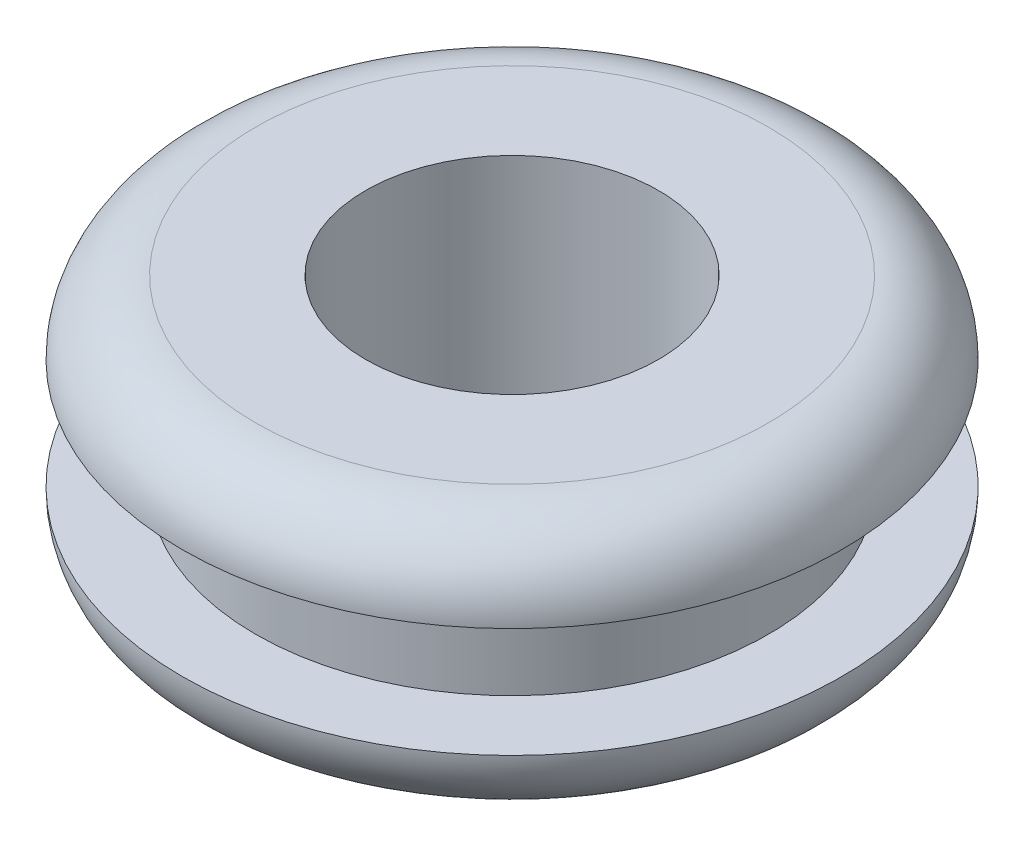
ISO-10303-21;
HEADER;
FILE_DESCRIPTION(('STEP AP214'),'2;1');
FILE_NAME('part.step','',(''),(''),'','','');
FILE_SCHEMA(('AUTOMOTIVE_DESIGN { 1 0 10303 214 1 1 1 1 }'));
ENDSEC;
DATA;
#1=APPLICATION_CONTEXT('core data for automotive mechanical design processes');
#2=APPLICATION_PROTOCOL_DEFINITION('international standard','automotive_design',2000,#1);
#3=PRODUCT_CONTEXT('',#1,'mechanical');
#4=PRODUCT('Part','Part','',(#3));
#5=PRODUCT_RELATED_PRODUCT_CATEGORY('part','',(#4));
#6=PRODUCT_DEFINITION_FORMATION('','',#4);
#7=PRODUCT_DEFINITION_CONTEXT('part definition',#1,'design');
#8=PRODUCT_DEFINITION('design','',#6,#7);
#9=PRODUCT_DEFINITION_SHAPE('','',#8);
#10=(LENGTH_UNIT() NAMED_UNIT(*) SI_UNIT(.MILLI.,.METRE.));
#11=(NAMED_UNIT(*) PLANE_ANGLE_UNIT() SI_UNIT($,.RADIAN.));
#12=(NAMED_UNIT(*) SI_UNIT($,.STERADIAN.) SOLID_ANGLE_UNIT());
#13=UNCERTAINTY_MEASURE_WITH_UNIT(LENGTH_MEASURE(1.E-05),#10,'distance_accuracy_value','');
#14=(GEOMETRIC_REPRESENTATION_CONTEXT(3) GLOBAL_UNCERTAINTY_ASSIGNED_CONTEXT((#13)) GLOBAL_UNIT_ASSIGNED_CONTEXT((#10,
#11,#12)) REPRESENTATION_CONTEXT('',''));
#15=CARTESIAN_POINT('',(0.,0.,0.));
#16=DIRECTION('',(0.,0.,1.));
#17=DIRECTION('',(1.,0.,0.));
#18=AXIS2_PLACEMENT_3D('',#15,#16,#17);
#19=CARTESIAN_POINT('',(0.,2.778125,0.));
#20=DIRECTION('',(0.,1.,0.));
#21=DIRECTION('',(0.,0.,1.));
#22=AXIS2_PLACEMENT_3D('',#19,#20,#21);
#23=CYLINDRICAL_SURFACE('',#22,5.55625);
#24=CARTESIAN_POINT('',(0.,1.190625,0.));
#25=DIRECTION('',(0.,1.,0.));
#26=DIRECTION('',(0.,0.,1.));
#27=AXIS2_PLACEMENT_3D('',#24,#25,#26);
#28=CIRCLE('',#27,5.55625);
#29=CARTESIAN_POINT('',(0.,1.190625,5.55625));
#30=VERTEX_POINT('',#29);
#31=EDGE_CURVE('E10',#30,#30,#28,.T.);
#32=ORIENTED_EDGE('',*,*,#31,.F.);
#33=EDGE_LOOP('',(#32));
#34=FACE_BOUND('',#33,.T.);
#35=CARTESIAN_POINT('',(0.,-1.190625,0.));
#36=DIRECTION('',(0.,1.,0.));
#37=DIRECTION('',(0.,0.,1.));
#38=AXIS2_PLACEMENT_3D('',#35,#36,#37);
#39=CIRCLE('',#38,5.55625);
#40=CARTESIAN_POINT('',(0.,-1.190625,5.55625));
#41=VERTEX_POINT('',#40);
#42=EDGE_CURVE('E58',#41,#41,#39,.T.);
#43=ORIENTED_EDGE('',*,*,#42,.T.);
#44=EDGE_LOOP('',(#43));
#45=FACE_BOUND('',#44,.T.);
#46=ADVANCED_FACE('F30',(#34,#45),#23,.T.);
#47=CARTESIAN_POINT('',(5.55625,1.190625,0.));
#48=DIRECTION('',(0.,1.,0.));
#49=DIRECTION('',(0.,0.,1.));
#50=AXIS2_PLACEMENT_3D('',#47,#48,#49);
#51=PLANE('',#50);
#52=CARTESIAN_POINT('',(0.,1.190625,0.));
#53=DIRECTION('',(0.,1.,0.));
#54=DIRECTION('',(0.,0.,1.));
#55=AXIS2_PLACEMENT_3D('',#52,#53,#54);
#56=CIRCLE('',#55,7.14375);
#57=CARTESIAN_POINT('',(0.,1.190625,7.14375));
#58=VERTEX_POINT('',#57);
#59=EDGE_CURVE('E36',#58,#58,#56,.T.);
#60=ORIENTED_EDGE('',*,*,#59,.F.);
#61=EDGE_LOOP('',(#60));
#62=FACE_BOUND('',#61,.T.);
#63=ORIENTED_EDGE('',*,*,#31,.T.);
#64=EDGE_LOOP('',(#63));
#65=FACE_BOUND('',#64,.T.);
#66=ADVANCED_FACE('F95',(#62,#65),#51,.F.);
#67=CARTESIAN_POINT('',(0.,1.190625,0.));
#68=DIRECTION('',(0.,1.,0.));
#69=DIRECTION('',(0.,0.,1.));
#70=AXIS2_PLACEMENT_3D('',#67,#68,#69);
#71=TOROIDAL_SURFACE('',#70,5.55625,1.5875);
#72=CARTESIAN_POINT('',(0.,2.778125,0.));
#73=DIRECTION('',(0.,1.,0.));
#74=DIRECTION('',(0.,0.,1.));
#75=AXIS2_PLACEMENT_3D('',#72,#73,#74);
#76=CIRCLE('',#75,5.55625);
#77=CARTESIAN_POINT('',(0.,2.778125,5.55625));
#78=VERTEX_POINT('',#77);
#79=EDGE_CURVE('E40',#78,#78,#76,.T.);
#80=ORIENTED_EDGE('',*,*,#79,.F.);
#81=EDGE_LOOP('',(#80));
#82=FACE_BOUND('',#81,.T.);
#83=ORIENTED_EDGE('',*,*,#59,.T.);
#84=EDGE_LOOP('',(#83));
#85=FACE_BOUND('',#84,.T.);
#86=ADVANCED_FACE('F90',(#82,#85),#71,.T.);
#87=CARTESIAN_POINT('',(3.175,2.778125,0.));
#88=DIRECTION('',(0.,-1.,0.));
#89=DIRECTION('',(0.,0.,-1.));
#90=AXIS2_PLACEMENT_3D('',#87,#88,#89);
#91=PLANE('',#90);
#92=CARTESIAN_POINT('',(0.,2.778125,0.));
#93=DIRECTION('',(0.,1.,0.));
#94=DIRECTION('',(0.,0.,1.));
#95=AXIS2_PLACEMENT_3D('',#92,#93,#94);
#96=CIRCLE('',#95,3.175);
#97=CARTESIAN_POINT('',(0.,2.778125,3.175));
#98=VERTEX_POINT('',#97);
#99=EDGE_CURVE('E44',#98,#98,#96,.T.);
#100=ORIENTED_EDGE('',*,*,#99,.F.);
#101=EDGE_LOOP('',(#100));
#102=FACE_BOUND('',#101,.T.);
#103=ORIENTED_EDGE('',*,*,#79,.T.);
#104=EDGE_LOOP('',(#103));
#105=FACE_BOUND('',#104,.T.);
#106=ADVANCED_FACE('F84',(#102,#105),#91,.F.);
#107=CARTESIAN_POINT('',(0.,2.778125,0.));
#108=DIRECTION('',(0.,1.,0.));
#109=DIRECTION('',(0.,0.,1.));
#110=AXIS2_PLACEMENT_3D('',#107,#108,#109);
#111=CYLINDRICAL_SURFACE('',#110,3.175);
#112=CARTESIAN_POINT('',(0.,-2.778125,0.));
#113=DIRECTION('',(0.,1.,0.));
#114=DIRECTION('',(0.,0.,1.));
#115=AXIS2_PLACEMENT_3D('',#112,#113,#114);
#116=CIRCLE('',#115,3.175);
#117=CARTESIAN_POINT('',(0.,-2.778125,3.175));
#118=VERTEX_POINT('',#117);
#119=EDGE_CURVE('E49',#118,#118,#116,.T.);
#120=ORIENTED_EDGE('',*,*,#119,.F.);
#121=EDGE_LOOP('',(#120));
#122=FACE_BOUND('',#121,.T.);
#123=ORIENTED_EDGE('',*,*,#99,.T.);
#124=EDGE_LOOP('',(#123));
#125=FACE_BOUND('',#124,.T.);
#126=ADVANCED_FACE('F78',(#122,#125),#111,.F.);
#127=CARTESIAN_POINT('',(3.175,-2.778125,0.));
#128=DIRECTION('',(0.,1.,0.));
#129=DIRECTION('',(0.,0.,1.));
#130=AXIS2_PLACEMENT_3D('',#127,#128,#129);
#131=PLANE('',#130);
#132=CARTESIAN_POINT('',(0.,-2.778125,0.));
#133=DIRECTION('',(0.,1.,0.));
#134=DIRECTION('',(0.,0.,1.));
#135=AXIS2_PLACEMENT_3D('',#132,#133,#134);
#136=CIRCLE('',#135,5.55625);
#137=CARTESIAN_POINT('',(0.,-2.778125,5.55625));
#138=VERTEX_POINT('',#137);
#139=EDGE_CURVE('E52',#138,#138,#136,.T.);
#140=ORIENTED_EDGE('',*,*,#139,.F.);
#141=EDGE_LOOP('',(#140));
#142=FACE_BOUND('',#141,.T.);
#143=ORIENTED_EDGE('',*,*,#119,.T.);
#144=EDGE_LOOP('',(#143));
#145=FACE_BOUND('',#144,.T.);
#146=ADVANCED_FACE('F72',(#142,#145),#131,.F.);
#147=CARTESIAN_POINT('',(0.,-1.190625,0.));
#148=DIRECTION('',(0.,1.,0.));
#149=DIRECTION('',(0.,0.,1.));
#150=AXIS2_PLACEMENT_3D('',#147,#148,#149);
#151=TOROIDAL_SURFACE('',#150,5.55625,1.5875);
#152=CARTESIAN_POINT('',(0.,-1.190625,0.));
#153=DIRECTION('',(0.,1.,0.));
#154=DIRECTION('',(0.,0.,1.));
#155=AXIS2_PLACEMENT_3D('',#152,#153,#154);
#156=CIRCLE('',#155,7.14375);
#157=CARTESIAN_POINT('',(0.,-1.190625,7.14375));
#158=VERTEX_POINT('',#157);
#159=EDGE_CURVE('E55',#158,#158,#156,.T.);
#160=ORIENTED_EDGE('',*,*,#159,.F.);
#161=EDGE_LOOP('',(#160));
#162=FACE_BOUND('',#161,.T.);
#163=ORIENTED_EDGE('',*,*,#139,.T.);
#164=EDGE_LOOP('',(#163));
#165=FACE_BOUND('',#164,.T.);
#166=ADVANCED_FACE('F66',(#162,#165),#151,.T.);
#167=CARTESIAN_POINT('',(7.14375,-1.190625,0.));
#168=DIRECTION('',(0.,-1.,0.));
#169=DIRECTION('',(0.,0.,-1.));
#170=AXIS2_PLACEMENT_3D('',#167,#168,#169);
#171=PLANE('',#170);
#172=ORIENTED_EDGE('',*,*,#42,.F.);
#173=EDGE_LOOP('',(#172));
#174=FACE_BOUND('',#173,.T.);
#175=ORIENTED_EDGE('',*,*,#159,.T.);
#176=EDGE_LOOP('',(#175));
#177=FACE_BOUND('',#176,.T.);
#178=ADVANCED_FACE('F63',(#174,#177),#171,.F.);
#179=CLOSED_SHELL('',(#46,#66,#86,#106,#126,#146,#166,#178));
#180=MANIFOLD_SOLID_BREP('B2',#179);
#181=ADVANCED_BREP_SHAPE_REPRESENTATION('',(#18,#180),#14);
#182=SHAPE_DEFINITION_REPRESENTATION(#9,#181);
ENDSEC;
END-ISO-10303-21;
